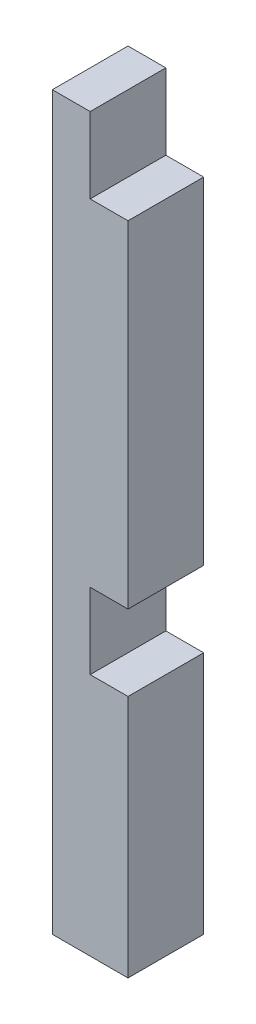
ISO-10303-21;
HEADER;
FILE_DESCRIPTION(('STEP AP214'),'2;1');
FILE_NAME('part.step','',(''),(''),'','','');
FILE_SCHEMA(('AUTOMOTIVE_DESIGN { 1 0 10303 214 1 1 1 1 }'));
ENDSEC;
DATA;
#1=APPLICATION_CONTEXT('core data for automotive mechanical design processes');
#2=APPLICATION_PROTOCOL_DEFINITION('international standard','automotive_design',2000,#1);
#3=PRODUCT_CONTEXT('',#1,'mechanical');
#4=PRODUCT('Part','Part','',(#3));
#5=PRODUCT_RELATED_PRODUCT_CATEGORY('part','',(#4));
#6=PRODUCT_DEFINITION_FORMATION('','',#4);
#7=PRODUCT_DEFINITION_CONTEXT('part definition',#1,'design');
#8=PRODUCT_DEFINITION('design','',#6,#7);
#9=PRODUCT_DEFINITION_SHAPE('','',#8);
#10=(LENGTH_UNIT() NAMED_UNIT(*) SI_UNIT(.MILLI.,.METRE.));
#11=(NAMED_UNIT(*) PLANE_ANGLE_UNIT() SI_UNIT($,.RADIAN.));
#12=(NAMED_UNIT(*) SI_UNIT($,.STERADIAN.) SOLID_ANGLE_UNIT());
#13=UNCERTAINTY_MEASURE_WITH_UNIT(LENGTH_MEASURE(1.E-05),#10,'distance_accuracy_value','');
#14=(GEOMETRIC_REPRESENTATION_CONTEXT(3) GLOBAL_UNCERTAINTY_ASSIGNED_CONTEXT((#13)) GLOBAL_UNIT_ASSIGNED_CONTEXT((#10,
#11,#12)) REPRESENTATION_CONTEXT('',''));
#15=CARTESIAN_POINT('',(0.,0.,0.));
#16=DIRECTION('',(0.,0.,1.));
#17=DIRECTION('',(1.,0.,0.));
#18=AXIS2_PLACEMENT_3D('',#15,#16,#17);
#19=CARTESIAN_POINT('',(90.,870.,0.));
#20=DIRECTION('',(-1.,0.,0.));
#21=DIRECTION('',(0.,0.,1.));
#22=AXIS2_PLACEMENT_3D('',#19,#20,#21);
#23=PLANE('',#22);
#24=DIRECTION('',(0.,-1.,0.));
#25=VECTOR('',#24,1.);
#26=CARTESIAN_POINT('',(90.,870.,0.));
#27=LINE('',#26,#25);
#28=CARTESIAN_POINT('',(90.,780.,0.));
#29=VERTEX_POINT('',#28);
#30=CARTESIAN_POINT('',(90.,380.,0.));
#31=VERTEX_POINT('',#30);
#32=EDGE_CURVE('E41',#29,#31,#27,.T.);
#33=ORIENTED_EDGE('',*,*,#32,.T.);
#34=DIRECTION('',(0.,0.,1.));
#35=VECTOR('',#34,1.);
#36=CARTESIAN_POINT('',(90.,380.,0.));
#37=LINE('',#36,#35);
#38=CARTESIAN_POINT('',(90.,380.,-90.));
#39=VERTEX_POINT('',#38);
#40=EDGE_CURVE('E126',#39,#31,#37,.T.);
#41=ORIENTED_EDGE('',*,*,#40,.F.);
#42=DIRECTION('',(0.,-1.,0.));
#43=VECTOR('',#42,1.);
#44=CARTESIAN_POINT('',(90.,870.,-90.));
#45=LINE('',#44,#43);
#46=CARTESIAN_POINT('',(90.,780.,-90.));
#47=VERTEX_POINT('',#46);
#48=EDGE_CURVE('E176',#47,#39,#45,.T.);
#49=ORIENTED_EDGE('',*,*,#48,.F.);
#50=DIRECTION('',(0.,0.,-1.));
#51=VECTOR('',#50,1.);
#52=CARTESIAN_POINT('',(90.,780.,0.));
#53=LINE('',#52,#51);
#54=EDGE_CURVE('E142',#29,#47,#53,.T.);
#55=ORIENTED_EDGE('',*,*,#54,.F.);
#56=EDGE_LOOP('',(#33,#41,#49,#55));
#57=FACE_BOUND('',#56,.T.);
#58=ADVANCED_FACE('F33',(#57),#23,.F.);
#59=CARTESIAN_POINT('',(0.,870.,0.));
#60=DIRECTION('',(0.,-1.,0.));
#61=DIRECTION('',(0.,0.,-1.));
#62=AXIS2_PLACEMENT_3D('',#59,#60,#61);
#63=PLANE('',#62);
#64=DIRECTION('',(0.,0.,1.));
#65=VECTOR('',#64,1.);
#66=CARTESIAN_POINT('',(45.,870.,0.));
#67=LINE('',#66,#65);
#68=CARTESIAN_POINT('',(45.,870.,-90.));
#69=VERTEX_POINT('',#68);
#70=CARTESIAN_POINT('',(45.,870.,0.));
#71=VERTEX_POINT('',#70);
#72=EDGE_CURVE('E145',#69,#71,#67,.T.);
#73=ORIENTED_EDGE('',*,*,#72,.F.);
#74=DIRECTION('',(-1.,0.,0.));
#75=VECTOR('',#74,1.);
#76=CARTESIAN_POINT('',(0.,870.,-90.));
#77=LINE('',#76,#75);
#78=CARTESIAN_POINT('',(0.,870.,-90.));
#79=VERTEX_POINT('',#78);
#80=EDGE_CURVE('E162',#69,#79,#77,.T.);
#81=ORIENTED_EDGE('',*,*,#80,.T.);
#82=DIRECTION('',(0.,0.,1.));
#83=VECTOR('',#82,1.);
#84=CARTESIAN_POINT('',(0.,870.,0.));
#85=LINE('',#84,#83);
#86=CARTESIAN_POINT('',(0.,870.,0.));
#87=VERTEX_POINT('',#86);
#88=EDGE_CURVE('E155',#79,#87,#85,.T.);
#89=ORIENTED_EDGE('',*,*,#88,.T.);
#90=DIRECTION('',(1.,0.,0.));
#91=VECTOR('',#90,1.);
#92=CARTESIAN_POINT('',(0.,870.,0.));
#93=LINE('',#92,#91);
#94=EDGE_CURVE('E158',#87,#71,#93,.T.);
#95=ORIENTED_EDGE('',*,*,#94,.T.);
#96=EDGE_LOOP('',(#73,#81,#89,#95));
#97=FACE_BOUND('',#96,.T.);
#98=ADVANCED_FACE('F200',(#97),#63,.F.);
#99=CARTESIAN_POINT('',(0.,870.,0.));
#100=DIRECTION('',(1.,0.,0.));
#101=DIRECTION('',(0.,0.,-1.));
#102=AXIS2_PLACEMENT_3D('',#99,#100,#101);
#103=PLANE('',#102);
#104=DIRECTION('',(0.,0.,1.));
#105=VECTOR('',#104,1.);
#106=CARTESIAN_POINT('',(0.,0.,0.));
#107=LINE('',#106,#105);
#108=CARTESIAN_POINT('',(0.,0.,-90.));
#109=VERTEX_POINT('',#108);
#110=CARTESIAN_POINT('',(0.,0.,0.));
#111=VERTEX_POINT('',#110);
#112=EDGE_CURVE('E153',#109,#111,#107,.T.);
#113=ORIENTED_EDGE('',*,*,#112,.T.);
#114=DIRECTION('',(0.,-1.,0.));
#115=VECTOR('',#114,1.);
#116=CARTESIAN_POINT('',(0.,870.,0.));
#117=LINE('',#116,#115);
#118=EDGE_CURVE('E11',#87,#111,#117,.T.);
#119=ORIENTED_EDGE('',*,*,#118,.F.);
#120=ORIENTED_EDGE('',*,*,#88,.F.);
#121=DIRECTION('',(0.,-1.,0.));
#122=VECTOR('',#121,1.);
#123=CARTESIAN_POINT('',(0.,870.,-90.));
#124=LINE('',#123,#122);
#125=EDGE_CURVE('E164',#79,#109,#124,.T.);
#126=ORIENTED_EDGE('',*,*,#125,.T.);
#127=EDGE_LOOP('',(#113,#119,#120,#126));
#128=FACE_BOUND('',#127,.T.);
#129=ADVANCED_FACE('F35',(#128),#103,.F.);
#130=CARTESIAN_POINT('',(0.,870.,0.));
#131=DIRECTION('',(0.,0.,-1.));
#132=DIRECTION('',(-1.,0.,0.));
#133=AXIS2_PLACEMENT_3D('',#130,#131,#132);
#134=PLANE('',#133);
#135=DIRECTION('',(0.,-1.,0.));
#136=VECTOR('',#135,1.);
#137=CARTESIAN_POINT('',(45.,290.,0.));
#138=LINE('',#137,#136);
#139=CARTESIAN_POINT('',(45.,380.,0.));
#140=VERTEX_POINT('',#139);
#141=CARTESIAN_POINT('',(45.,290.,0.));
#142=VERTEX_POINT('',#141);
#143=EDGE_CURVE('E117',#140,#142,#138,.T.);
#144=ORIENTED_EDGE('',*,*,#143,.F.);
#145=DIRECTION('',(1.,0.,0.));
#146=VECTOR('',#145,1.);
#147=CARTESIAN_POINT('',(45.,380.,0.));
#148=LINE('',#147,#146);
#149=EDGE_CURVE('E149',#140,#31,#148,.T.);
#150=ORIENTED_EDGE('',*,*,#149,.T.);
#151=ORIENTED_EDGE('',*,*,#32,.F.);
#152=DIRECTION('',(1.,0.,0.));
#153=VECTOR('',#152,1.);
#154=CARTESIAN_POINT('',(45.,780.,0.));
#155=LINE('',#154,#153);
#156=CARTESIAN_POINT('',(45.,780.,0.));
#157=VERTEX_POINT('',#156);
#158=EDGE_CURVE('E147',#157,#29,#155,.T.);
#159=ORIENTED_EDGE('',*,*,#158,.F.);
#160=DIRECTION('',(0.,-1.,0.));
#161=VECTOR('',#160,1.);
#162=CARTESIAN_POINT('',(45.,870.,0.));
#163=LINE('',#162,#161);
#164=EDGE_CURVE('E138',#71,#157,#163,.T.);
#165=ORIENTED_EDGE('',*,*,#164,.F.);
#166=ORIENTED_EDGE('',*,*,#94,.F.);
#167=ORIENTED_EDGE('',*,*,#118,.T.);
#168=DIRECTION('',(1.,0.,0.));
#169=VECTOR('',#168,1.);
#170=CARTESIAN_POINT('',(0.,0.,0.));
#171=LINE('',#170,#169);
#172=CARTESIAN_POINT('',(90.,0.,0.));
#173=VERTEX_POINT('',#172);
#174=EDGE_CURVE('E167',#111,#173,#171,.T.);
#175=ORIENTED_EDGE('',*,*,#174,.T.);
#176=CARTESIAN_POINT('',(90.,290.,0.));
#177=VERTEX_POINT('',#176);
#178=EDGE_CURVE('E131',#177,#173,#27,.T.);
#179=ORIENTED_EDGE('',*,*,#178,.F.);
#180=DIRECTION('',(1.,0.,0.));
#181=VECTOR('',#180,1.);
#182=CARTESIAN_POINT('',(45.,290.,0.));
#183=LINE('',#182,#181);
#184=EDGE_CURVE('E111',#142,#177,#183,.T.);
#185=ORIENTED_EDGE('',*,*,#184,.F.);
#186=EDGE_LOOP('',(#144,#150,#151,#159,#165,#166,#167,#175,#179,#185));
#187=FACE_BOUND('',#186,.T.);
#188=ADVANCED_FACE('F129',(#187),#134,.F.);
#189=CARTESIAN_POINT('',(90.,290.,-90.));
#190=VERTEX_POINT('',#189);
#191=CARTESIAN_POINT('',(90.,0.,-90.));
#192=VERTEX_POINT('',#191);
#193=EDGE_CURVE('E175',#190,#192,#45,.T.);
#194=ORIENTED_EDGE('',*,*,#193,.F.);
#195=DIRECTION('',(0.,0.,-1.));
#196=VECTOR('',#195,1.);
#197=CARTESIAN_POINT('',(90.,290.,0.));
#198=LINE('',#197,#196);
#199=EDGE_CURVE('E188',#177,#190,#198,.T.);
#200=ORIENTED_EDGE('',*,*,#199,.F.);
#201=ORIENTED_EDGE('',*,*,#178,.T.);
#202=DIRECTION('',(0.,0.,-1.));
#203=VECTOR('',#202,1.);
#204=CARTESIAN_POINT('',(90.,0.,0.));
#205=LINE('',#204,#203);
#206=EDGE_CURVE('E169',#173,#192,#205,.T.);
#207=ORIENTED_EDGE('',*,*,#206,.T.);
#208=EDGE_LOOP('',(#194,#200,#201,#207));
#209=FACE_BOUND('',#208,.T.);
#210=ADVANCED_FACE('F185',(#209),#23,.F.);
#211=CARTESIAN_POINT('',(0.,870.,-90.));
#212=DIRECTION('',(0.,0.,1.));
#213=DIRECTION('',(1.,0.,0.));
#214=AXIS2_PLACEMENT_3D('',#211,#212,#213);
#215=PLANE('',#214);
#216=ORIENTED_EDGE('',*,*,#48,.T.);
#217=DIRECTION('',(1.,0.,0.));
#218=VECTOR('',#217,1.);
#219=CARTESIAN_POINT('',(45.,380.,-90.));
#220=LINE('',#219,#218);
#221=CARTESIAN_POINT('',(45.,380.,-90.));
#222=VERTEX_POINT('',#221);
#223=EDGE_CURVE('E133',#222,#39,#220,.T.);
#224=ORIENTED_EDGE('',*,*,#223,.F.);
#225=DIRECTION('',(0.,1.,0.));
#226=VECTOR('',#225,1.);
#227=CARTESIAN_POINT('',(45.,290.,-90.));
#228=LINE('',#227,#226);
#229=CARTESIAN_POINT('',(45.,290.,-90.));
#230=VERTEX_POINT('',#229);
#231=EDGE_CURVE('E116',#230,#222,#228,.T.);
#232=ORIENTED_EDGE('',*,*,#231,.F.);
#233=DIRECTION('',(1.,0.,0.));
#234=VECTOR('',#233,1.);
#235=CARTESIAN_POINT('',(45.,290.,-90.));
#236=LINE('',#235,#234);
#237=EDGE_CURVE('E114',#230,#190,#236,.T.);
#238=ORIENTED_EDGE('',*,*,#237,.T.);
#239=ORIENTED_EDGE('',*,*,#193,.T.);
#240=DIRECTION('',(-1.,0.,0.));
#241=VECTOR('',#240,1.);
#242=CARTESIAN_POINT('',(0.,0.,-90.));
#243=LINE('',#242,#241);
#244=EDGE_CURVE('E159',#192,#109,#243,.T.);
#245=ORIENTED_EDGE('',*,*,#244,.T.);
#246=ORIENTED_EDGE('',*,*,#125,.F.);
#247=ORIENTED_EDGE('',*,*,#80,.F.);
#248=DIRECTION('',(0.,1.,0.));
#249=VECTOR('',#248,1.);
#250=CARTESIAN_POINT('',(45.,870.,-90.));
#251=LINE('',#250,#249);
#252=CARTESIAN_POINT('',(45.,780.,-90.));
#253=VERTEX_POINT('',#252);
#254=EDGE_CURVE('E56',#253,#69,#251,.T.);
#255=ORIENTED_EDGE('',*,*,#254,.F.);
#256=DIRECTION('',(1.,0.,0.));
#257=VECTOR('',#256,1.);
#258=CARTESIAN_POINT('',(45.,780.,-90.));
#259=LINE('',#258,#257);
#260=EDGE_CURVE('E150',#253,#47,#259,.T.);
#261=ORIENTED_EDGE('',*,*,#260,.T.);
#262=EDGE_LOOP('',(#216,#224,#232,#238,#239,#245,#246,#247,#255,#261));
#263=FACE_BOUND('',#262,.T.);
#264=ADVANCED_FACE('F195',(#263),#215,.F.);
#265=CARTESIAN_POINT('',(0.,0.,0.));
#266=DIRECTION('',(0.,-1.,0.));
#267=DIRECTION('',(0.,0.,-1.));
#268=AXIS2_PLACEMENT_3D('',#265,#266,#267);
#269=PLANE('',#268);
#270=ORIENTED_EDGE('',*,*,#112,.F.);
#271=ORIENTED_EDGE('',*,*,#244,.F.);
#272=ORIENTED_EDGE('',*,*,#206,.F.);
#273=ORIENTED_EDGE('',*,*,#174,.F.);
#274=EDGE_LOOP('',(#270,#271,#272,#273));
#275=FACE_BOUND('',#274,.T.);
#276=ADVANCED_FACE('F192',(#275),#269,.T.);
#277=CARTESIAN_POINT('',(45.,780.,0.));
#278=DIRECTION('',(0.,-1.,0.));
#279=DIRECTION('',(0.,0.,-1.));
#280=AXIS2_PLACEMENT_3D('',#277,#278,#279);
#281=PLANE('',#280);
#282=ORIENTED_EDGE('',*,*,#54,.T.);
#283=ORIENTED_EDGE('',*,*,#260,.F.);
#284=DIRECTION('',(0.,0.,-1.));
#285=VECTOR('',#284,1.);
#286=CARTESIAN_POINT('',(45.,780.,0.));
#287=LINE('',#286,#285);
#288=EDGE_CURVE('E141',#157,#253,#287,.T.);
#289=ORIENTED_EDGE('',*,*,#288,.F.);
#290=ORIENTED_EDGE('',*,*,#158,.T.);
#291=EDGE_LOOP('',(#282,#283,#289,#290));
#292=FACE_BOUND('',#291,.T.);
#293=ADVANCED_FACE('F212',(#292),#281,.F.);
#294=CARTESIAN_POINT('',(45.,0.,0.));
#295=DIRECTION('',(1.,0.,0.));
#296=DIRECTION('',(0.,0.,-1.));
#297=AXIS2_PLACEMENT_3D('',#294,#295,#296);
#298=PLANE('',#297);
#299=ORIENTED_EDGE('',*,*,#164,.T.);
#300=ORIENTED_EDGE('',*,*,#288,.T.);
#301=ORIENTED_EDGE('',*,*,#254,.T.);
#302=ORIENTED_EDGE('',*,*,#72,.T.);
#303=EDGE_LOOP('',(#299,#300,#301,#302));
#304=FACE_BOUND('',#303,.T.);
#305=ADVANCED_FACE('F213',(#304),#298,.T.);
#306=CARTESIAN_POINT('',(45.,380.,0.));
#307=DIRECTION('',(0.,1.,0.));
#308=DIRECTION('',(0.,0.,1.));
#309=AXIS2_PLACEMENT_3D('',#306,#307,#308);
#310=PLANE('',#309);
#311=ORIENTED_EDGE('',*,*,#40,.T.);
#312=ORIENTED_EDGE('',*,*,#149,.F.);
#313=DIRECTION('',(0.,0.,1.));
#314=VECTOR('',#313,1.);
#315=CARTESIAN_POINT('',(45.,380.,0.));
#316=LINE('',#315,#314);
#317=EDGE_CURVE('E123',#222,#140,#316,.T.);
#318=ORIENTED_EDGE('',*,*,#317,.F.);
#319=ORIENTED_EDGE('',*,*,#223,.T.);
#320=EDGE_LOOP('',(#311,#312,#318,#319));
#321=FACE_BOUND('',#320,.T.);
#322=ADVANCED_FACE('F208',(#321),#310,.F.);
#323=CARTESIAN_POINT('',(45.,290.,0.));
#324=DIRECTION('',(0.,-1.,0.));
#325=DIRECTION('',(0.,0.,-1.));
#326=AXIS2_PLACEMENT_3D('',#323,#324,#325);
#327=PLANE('',#326);
#328=ORIENTED_EDGE('',*,*,#199,.T.);
#329=ORIENTED_EDGE('',*,*,#237,.F.);
#330=DIRECTION('',(0.,0.,-1.));
#331=VECTOR('',#330,1.);
#332=CARTESIAN_POINT('',(45.,290.,0.));
#333=LINE('',#332,#331);
#334=EDGE_CURVE('E48',#142,#230,#333,.T.);
#335=ORIENTED_EDGE('',*,*,#334,.F.);
#336=ORIENTED_EDGE('',*,*,#184,.T.);
#337=EDGE_LOOP('',(#328,#329,#335,#336));
#338=FACE_BOUND('',#337,.T.);
#339=ADVANCED_FACE('F109',(#338),#327,.F.);
#340=CARTESIAN_POINT('',(45.,0.,0.));
#341=DIRECTION('',(-1.,0.,0.));
#342=DIRECTION('',(0.,0.,1.));
#343=AXIS2_PLACEMENT_3D('',#340,#341,#342);
#344=PLANE('',#343);
#345=ORIENTED_EDGE('',*,*,#143,.T.);
#346=ORIENTED_EDGE('',*,*,#334,.T.);
#347=ORIENTED_EDGE('',*,*,#231,.T.);
#348=ORIENTED_EDGE('',*,*,#317,.T.);
#349=EDGE_LOOP('',(#345,#346,#347,#348));
#350=FACE_BOUND('',#349,.T.);
#351=ADVANCED_FACE('F121',(#350),#344,.F.);
#352=CLOSED_SHELL('',(#58,#98,#129,#188,#210,#264,#276,#293,#305,#322,#339,#351));
#353=MANIFOLD_SOLID_BREP('B2',#352);
#354=ADVANCED_BREP_SHAPE_REPRESENTATION('',(#18,#353),#14);
#355=SHAPE_DEFINITION_REPRESENTATION(#9,#354);
ENDSEC;
END-ISO-10303-21;
